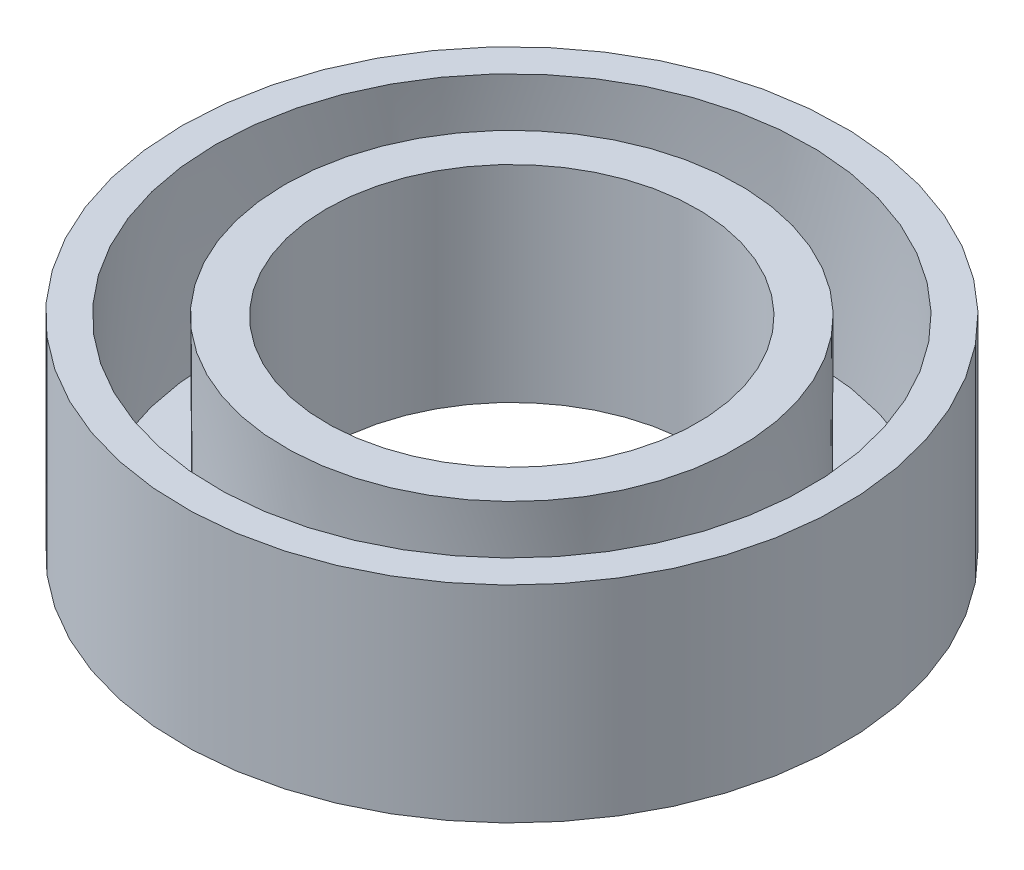
ISO-10303-21;
HEADER;
FILE_DESCRIPTION(('STEP AP214'),'2;1');
FILE_NAME('part.step','',(''),(''),'','','');
FILE_SCHEMA(('AUTOMOTIVE_DESIGN { 1 0 10303 214 1 1 1 1 }'));
ENDSEC;
DATA;
#1=APPLICATION_CONTEXT('core data for automotive mechanical design processes');
#2=APPLICATION_PROTOCOL_DEFINITION('international standard','automotive_design',2000,#1);
#3=PRODUCT_CONTEXT('',#1,'mechanical');
#4=PRODUCT('Part','Part','',(#3));
#5=PRODUCT_RELATED_PRODUCT_CATEGORY('part','',(#4));
#6=PRODUCT_DEFINITION_FORMATION('','',#4);
#7=PRODUCT_DEFINITION_CONTEXT('part definition',#1,'design');
#8=PRODUCT_DEFINITION('design','',#6,#7);
#9=PRODUCT_DEFINITION_SHAPE('','',#8);
#10=(LENGTH_UNIT() NAMED_UNIT(*) SI_UNIT(.MILLI.,.METRE.));
#11=(NAMED_UNIT(*) PLANE_ANGLE_UNIT() SI_UNIT($,.RADIAN.));
#12=(NAMED_UNIT(*) SI_UNIT($,.STERADIAN.) SOLID_ANGLE_UNIT());
#13=UNCERTAINTY_MEASURE_WITH_UNIT(LENGTH_MEASURE(1.E-05),#10,'distance_accuracy_value','');
#14=(GEOMETRIC_REPRESENTATION_CONTEXT(3) GLOBAL_UNCERTAINTY_ASSIGNED_CONTEXT((#13)) GLOBAL_UNIT_ASSIGNED_CONTEXT((#10,
#11,#12)) REPRESENTATION_CONTEXT('',''));
#15=CARTESIAN_POINT('',(0.,0.,0.));
#16=DIRECTION('',(0.,0.,1.));
#17=DIRECTION('',(1.,0.,0.));
#18=AXIS2_PLACEMENT_3D('',#15,#16,#17);
#19=CARTESIAN_POINT('',(-33.8614457831325,3.50443005783626,0.));
#20=DIRECTION('',(0.,-1.,0.));
#21=DIRECTION('',(1.,0.,0.));
#22=AXIS2_PLACEMENT_3D('',#19,#20,#21);
#23=PLANE('',#22);
#24=CARTESIAN_POINT('',(-25.8614457831325,3.50443005783627,0.));
#25=DIRECTION('',(0.,1.,0.));
#26=DIRECTION('',(-1.,0.,0.));
#27=AXIS2_PLACEMENT_3D('',#24,#25,#26);
#28=CIRCLE('',#27,4.50000000000001);
#29=CARTESIAN_POINT('',(-30.3614457831325,3.50443005783627,0.));
#30=VERTEX_POINT('',#29);
#31=EDGE_CURVE('E10',#30,#30,#28,.T.);
#32=ORIENTED_EDGE('',*,*,#31,.T.);
#33=EDGE_LOOP('',(#32));
#34=FACE_BOUND('',#33,.T.);
#35=CARTESIAN_POINT('',(-25.8614457831325,3.50443005783627,0.));
#36=DIRECTION('',(0.,1.,0.));
#37=DIRECTION('',(-1.,0.,0.));
#38=AXIS2_PLACEMENT_3D('',#35,#36,#37);
#39=CIRCLE('',#38,8.00000000000001);
#40=CARTESIAN_POINT('',(-33.8614457831325,3.50443005783627,0.));
#41=VERTEX_POINT('',#40);
#42=EDGE_CURVE('E65',#41,#41,#39,.T.);
#43=ORIENTED_EDGE('',*,*,#42,.F.);
#44=EDGE_LOOP('',(#43));
#45=FACE_BOUND('',#44,.T.);
#46=ADVANCED_FACE('F37',(#34,#45),#23,.T.);
#47=CARTESIAN_POINT('',(-25.8614457831325,61.6867469879518,0.));
#48=DIRECTION('',(0.,1.,0.));
#49=DIRECTION('',(-1.,0.,0.));
#50=AXIS2_PLACEMENT_3D('',#47,#48,#49);
#51=CYLINDRICAL_SURFACE('',#50,4.50000000000001);
#52=CARTESIAN_POINT('',(-25.8614457831325,8.50443005783626,0.));
#53=DIRECTION('',(0.,1.,0.));
#54=DIRECTION('',(-1.,0.,0.));
#55=AXIS2_PLACEMENT_3D('',#52,#53,#54);
#56=CIRCLE('',#55,4.50000000000001);
#57=CARTESIAN_POINT('',(-30.3614457831325,8.50443005783626,0.));
#58=VERTEX_POINT('',#57);
#59=EDGE_CURVE('E43',#58,#58,#56,.T.);
#60=ORIENTED_EDGE('',*,*,#59,.T.);
#61=EDGE_LOOP('',(#60));
#62=FACE_BOUND('',#61,.T.);
#63=ORIENTED_EDGE('',*,*,#31,.F.);
#64=EDGE_LOOP('',(#63));
#65=FACE_BOUND('',#64,.T.);
#66=ADVANCED_FACE('F73',(#62,#65),#51,.F.);
#67=CARTESIAN_POINT('',(-31.376885957465,8.50443005783626,0.));
#68=DIRECTION('',(0.,1.,0.));
#69=DIRECTION('',(-1.,0.,0.));
#70=AXIS2_PLACEMENT_3D('',#67,#68,#69);
#71=PLANE('',#70);
#72=CARTESIAN_POINT('',(-25.8614457831325,8.50443005783626,0.));
#73=DIRECTION('',(0.,1.,0.));
#74=DIRECTION('',(-1.,0.,0.));
#75=AXIS2_PLACEMENT_3D('',#72,#73,#74);
#76=CIRCLE('',#75,5.51544017433247);
#77=CARTESIAN_POINT('',(-31.376885957465,8.50443005783626,0.));
#78=VERTEX_POINT('',#77);
#79=EDGE_CURVE('E47',#78,#78,#76,.T.);
#80=ORIENTED_EDGE('',*,*,#79,.T.);
#81=EDGE_LOOP('',(#80));
#82=FACE_BOUND('',#81,.T.);
#83=ORIENTED_EDGE('',*,*,#59,.F.);
#84=EDGE_LOOP('',(#83));
#85=FACE_BOUND('',#84,.T.);
#86=ADVANCED_FACE('F77',(#82,#85),#71,.T.);
#87=CARTESIAN_POINT('',(-25.8614457831325,6.00443005783627,0.));
#88=DIRECTION('',(0.,1.,0.));
#89=DIRECTION('',(-1.,0.,0.));
#90=AXIS2_PLACEMENT_3D('',#87,#88,#89);
#91=TOROIDAL_SURFACE('',#90,55.3324680926854,49.8797180286532);
#92=CARTESIAN_POINT('',(-25.8614457831325,3.97107312845447,0.));
#93=DIRECTION('',(0.,1.,0.));
#94=DIRECTION('',(-1.,0.,0.));
#95=AXIS2_PLACEMENT_3D('',#92,#93,#94);
#96=CIRCLE('',#95,5.49421240274687);
#97=CARTESIAN_POINT('',(-31.3556581858794,3.97107312845447,0.));
#98=VERTEX_POINT('',#97);
#99=EDGE_CURVE('E51',#98,#98,#96,.T.);
#100=ORIENTED_EDGE('',*,*,#99,.T.);
#101=EDGE_LOOP('',(#100));
#102=FACE_BOUND('',#101,.T.);
#103=ORIENTED_EDGE('',*,*,#79,.F.);
#104=EDGE_LOOP('',(#103));
#105=FACE_BOUND('',#104,.T.);
#106=ADVANCED_FACE('F81',(#102,#105),#91,.F.);
#107=CARTESIAN_POINT('',(-33.0737983235437,3.97107312845447,0.));
#108=DIRECTION('',(0.,1.,0.));
#109=DIRECTION('',(-1.,0.,0.));
#110=AXIS2_PLACEMENT_3D('',#107,#108,#109);
#111=PLANE('',#110);
#112=CARTESIAN_POINT('',(-25.8614457831325,3.97107312845447,0.));
#113=DIRECTION('',(0.,1.,0.));
#114=DIRECTION('',(-1.,0.,0.));
#115=AXIS2_PLACEMENT_3D('',#112,#113,#114);
#116=CIRCLE('',#115,7.21235254041117);
#117=CARTESIAN_POINT('',(-33.0737983235437,3.97107312845447,0.));
#118=VERTEX_POINT('',#117);
#119=EDGE_CURVE('E56',#118,#118,#116,.T.);
#120=ORIENTED_EDGE('',*,*,#119,.T.);
#121=EDGE_LOOP('',(#120));
#122=FACE_BOUND('',#121,.T.);
#123=ORIENTED_EDGE('',*,*,#99,.F.);
#124=EDGE_LOOP('',(#123));
#125=FACE_BOUND('',#124,.T.);
#126=ADVANCED_FACE('F88',(#122,#125),#111,.T.);
#127=CARTESIAN_POINT('',(-25.8614457831325,6.00443005783626,0.));
#128=DIRECTION('',(0.,1.,0.));
#129=DIRECTION('',(-1.,0.,0.));
#130=AXIS2_PLACEMENT_3D('',#127,#128,#129);
#131=DEGENERATE_TOROIDAL_SURFACE('',#130,54.8180543851845,62.0637247009656,.F.);
#132=CARTESIAN_POINT('',(-25.8614457831325,8.50443005783626,0.));
#133=DIRECTION('',(0.,1.,0.));
#134=DIRECTION('',(-1.,0.,0.));
#135=AXIS2_PLACEMENT_3D('',#132,#133,#134);
#136=CIRCLE('',#135,7.19529840078614);
#137=CARTESIAN_POINT('',(-33.0567441839187,8.50443005783626,0.));
#138=VERTEX_POINT('',#137);
#139=EDGE_CURVE('E59',#138,#138,#136,.T.);
#140=ORIENTED_EDGE('',*,*,#139,.T.);
#141=EDGE_LOOP('',(#140));
#142=FACE_BOUND('',#141,.T.);
#143=ORIENTED_EDGE('',*,*,#119,.F.);
#144=EDGE_LOOP('',(#143));
#145=FACE_BOUND('',#144,.T.);
#146=ADVANCED_FACE('F92',(#142,#145),#131,.T.);
#147=CARTESIAN_POINT('',(-33.8614457831325,8.50443005783626,0.));
#148=DIRECTION('',(0.,1.,0.));
#149=DIRECTION('',(-1.,0.,0.));
#150=AXIS2_PLACEMENT_3D('',#147,#148,#149);
#151=PLANE('',#150);
#152=CARTESIAN_POINT('',(-25.8614457831325,8.50443005783626,0.));
#153=DIRECTION('',(0.,1.,0.));
#154=DIRECTION('',(-1.,0.,0.));
#155=AXIS2_PLACEMENT_3D('',#152,#153,#154);
#156=CIRCLE('',#155,8.00000000000001);
#157=CARTESIAN_POINT('',(-33.8614457831325,8.50443005783626,0.));
#158=VERTEX_POINT('',#157);
#159=EDGE_CURVE('E62',#158,#158,#156,.T.);
#160=ORIENTED_EDGE('',*,*,#159,.T.);
#161=EDGE_LOOP('',(#160));
#162=FACE_BOUND('',#161,.T.);
#163=ORIENTED_EDGE('',*,*,#139,.F.);
#164=EDGE_LOOP('',(#163));
#165=FACE_BOUND('',#164,.T.);
#166=ADVANCED_FACE('F96',(#162,#165),#151,.T.);
#167=CARTESIAN_POINT('',(-25.8614457831325,61.6867469879518,0.));
#168=DIRECTION('',(0.,1.,0.));
#169=DIRECTION('',(-1.,0.,0.));
#170=AXIS2_PLACEMENT_3D('',#167,#168,#169);
#171=CYLINDRICAL_SURFACE('',#170,8.00000000000001);
#172=ORIENTED_EDGE('',*,*,#42,.T.);
#173=EDGE_LOOP('',(#172));
#174=FACE_BOUND('',#173,.T.);
#175=ORIENTED_EDGE('',*,*,#159,.F.);
#176=EDGE_LOOP('',(#175));
#177=FACE_BOUND('',#176,.T.);
#178=ADVANCED_FACE('F69',(#174,#177),#171,.T.);
#179=CLOSED_SHELL('',(#46,#66,#86,#106,#126,#146,#166,#178));
#180=MANIFOLD_SOLID_BREP('B2',#179);
#181=ADVANCED_BREP_SHAPE_REPRESENTATION('',(#18,#180),#14);
#182=SHAPE_DEFINITION_REPRESENTATION(#9,#181);
ENDSEC;
END-ISO-10303-21;
